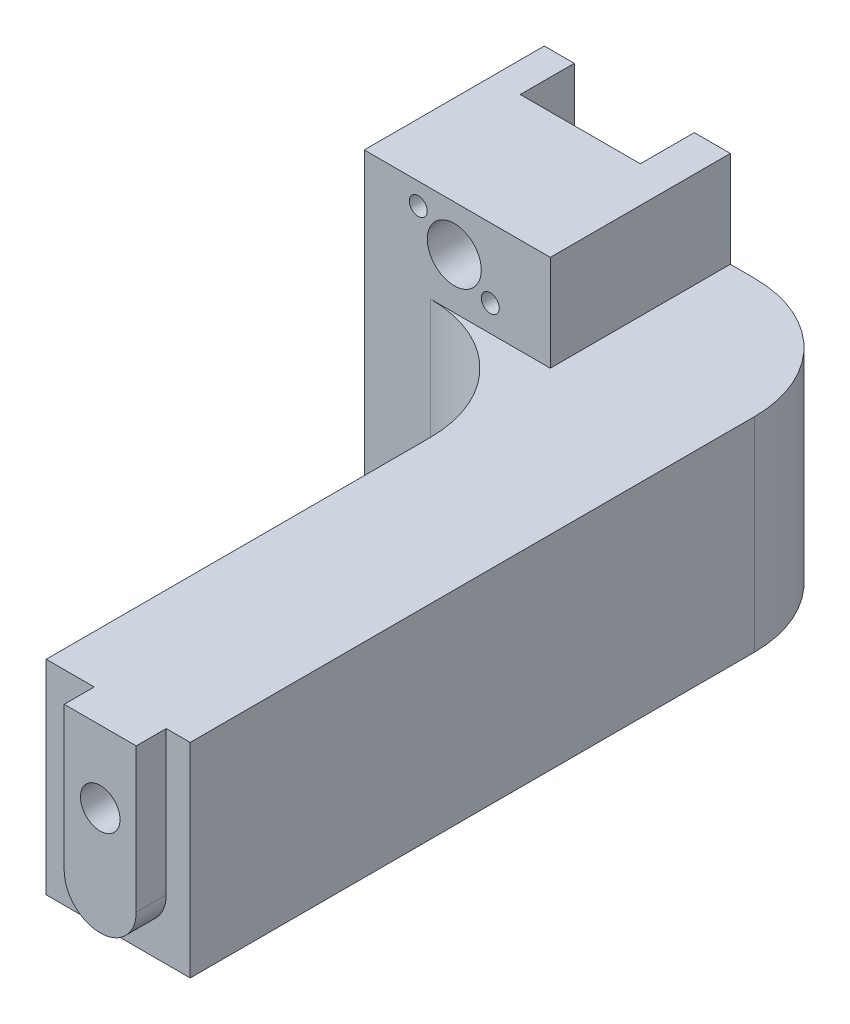
ISO-10303-21;
HEADER;
FILE_DESCRIPTION(('STEP AP214'),'2;1');
FILE_NAME('part.step','',(''),(''),'','','');
FILE_SCHEMA(('AUTOMOTIVE_DESIGN { 1 0 10303 214 1 1 1 1 }'));
ENDSEC;
DATA;
#1=APPLICATION_CONTEXT('core data for automotive mechanical design processes');
#2=APPLICATION_PROTOCOL_DEFINITION('international standard','automotive_design',2000,#1);
#3=PRODUCT_CONTEXT('',#1,'mechanical');
#4=PRODUCT('Part','Part','',(#3));
#5=PRODUCT_RELATED_PRODUCT_CATEGORY('part','',(#4));
#6=PRODUCT_DEFINITION_FORMATION('','',#4);
#7=PRODUCT_DEFINITION_CONTEXT('part definition',#1,'design');
#8=PRODUCT_DEFINITION('design','',#6,#7);
#9=PRODUCT_DEFINITION_SHAPE('','',#8);
#10=(LENGTH_UNIT() NAMED_UNIT(*) SI_UNIT(.MILLI.,.METRE.));
#11=(NAMED_UNIT(*) PLANE_ANGLE_UNIT() SI_UNIT($,.RADIAN.));
#12=(NAMED_UNIT(*) SI_UNIT($,.STERADIAN.) SOLID_ANGLE_UNIT());
#13=UNCERTAINTY_MEASURE_WITH_UNIT(LENGTH_MEASURE(1.E-05),#10,'distance_accuracy_value','');
#14=(GEOMETRIC_REPRESENTATION_CONTEXT(3) GLOBAL_UNCERTAINTY_ASSIGNED_CONTEXT((#13)) GLOBAL_UNIT_ASSIGNED_CONTEXT((#10,
#11,#12)) REPRESENTATION_CONTEXT('',''));
#15=CARTESIAN_POINT('',(0.,0.,0.));
#16=DIRECTION('',(0.,0.,1.));
#17=DIRECTION('',(1.,0.,0.));
#18=AXIS2_PLACEMENT_3D('',#15,#16,#17);
#19=CARTESIAN_POINT('',(-13.75,25.,28.5));
#20=DIRECTION('',(0.,0.,-1.));
#21=DIRECTION('',(-1.,0.,0.));
#22=AXIS2_PLACEMENT_3D('',#19,#20,#21);
#23=PLANE('',#22);
#24=DIRECTION('',(1.,0.,0.));
#25=VECTOR('',#24,1.);
#26=CARTESIAN_POINT('',(-13.75,17.,28.5));
#27=LINE('',#26,#25);
#28=CARTESIAN_POINT('',(1.75000000000001,17.,28.5));
#29=VERTEX_POINT('',#28);
#30=CARTESIAN_POINT('',(5.75,17.,28.5));
#31=VERTEX_POINT('',#30);
#32=EDGE_CURVE('E272',#29,#31,#27,.T.);
#33=ORIENTED_EDGE('',*,*,#32,.F.);
#34=DIRECTION('',(0.,1.,0.));
#35=VECTOR('',#34,1.);
#36=CARTESIAN_POINT('',(1.75000000000001,0.,28.5));
#37=LINE('',#36,#35);
#38=CARTESIAN_POINT('',(1.75000000000001,0.,28.5));
#39=VERTEX_POINT('',#38);
#40=EDGE_CURVE('E184',#39,#29,#37,.T.);
#41=ORIENTED_EDGE('',*,*,#40,.F.);
#42=DIRECTION('',(1.,0.,0.));
#43=VECTOR('',#42,1.);
#44=CARTESIAN_POINT('',(-13.75,0.,28.5));
#45=LINE('',#44,#43);
#46=CARTESIAN_POINT('',(13.75,0.,28.5));
#47=VERTEX_POINT('',#46);
#48=EDGE_CURVE('E202',#39,#47,#45,.T.);
#49=ORIENTED_EDGE('',*,*,#48,.T.);
#50=DIRECTION('',(0.,-1.,0.));
#51=VECTOR('',#50,1.);
#52=CARTESIAN_POINT('',(13.75,25.,28.5));
#53=LINE('',#52,#51);
#54=CARTESIAN_POINT('',(13.75,17.,28.5));
#55=VERTEX_POINT('',#54);
#56=EDGE_CURVE('E211',#55,#47,#53,.T.);
#57=ORIENTED_EDGE('',*,*,#56,.F.);
#58=DIRECTION('',(1.,0.,0.));
#59=VECTOR('',#58,1.);
#60=CARTESIAN_POINT('',(11.75,17.,28.5));
#61=LINE('',#60,#59);
#62=CARTESIAN_POINT('',(11.75,17.,28.5));
#63=VERTEX_POINT('',#62);
#64=EDGE_CURVE('E468',#63,#55,#61,.T.);
#65=ORIENTED_EDGE('',*,*,#64,.F.);
#66=DIRECTION('',(0.,1.,0.));
#67=VECTOR('',#66,1.);
#68=CARTESIAN_POINT('',(11.75,25.,28.5));
#69=LINE('',#68,#67);
#70=CARTESIAN_POINT('',(11.75,5.,28.5));
#71=VERTEX_POINT('',#70);
#72=EDGE_CURVE('E337',#71,#63,#69,.T.);
#73=ORIENTED_EDGE('',*,*,#72,.F.);
#74=CARTESIAN_POINT('',(8.75,5.,28.5));
#75=DIRECTION('',(0.,0.,1.));
#76=DIRECTION('',(1.,0.,0.));
#77=AXIS2_PLACEMENT_3D('',#74,#75,#76);
#78=CIRCLE('',#77,3.);
#79=CARTESIAN_POINT('',(5.75,5.,28.5));
#80=VERTEX_POINT('',#79);
#81=EDGE_CURVE('E314',#80,#71,#78,.T.);
#82=ORIENTED_EDGE('',*,*,#81,.F.);
#83=DIRECTION('',(0.,-1.,0.));
#84=VECTOR('',#83,1.);
#85=CARTESIAN_POINT('',(5.75,5.,28.5));
#86=LINE('',#85,#84);
#87=EDGE_CURVE('E329',#31,#80,#86,.T.);
#88=ORIENTED_EDGE('',*,*,#87,.F.);
#89=EDGE_LOOP('',(#33,#41,#49,#57,#65,#73,#82,#88));
#90=FACE_BOUND('',#89,.T.);
#91=ADVANCED_FACE('F36',(#90),#23,.F.);
#92=CARTESIAN_POINT('',(13.75,25.,-28.5));
#93=DIRECTION('',(-1.,0.,0.));
#94=DIRECTION('',(0.,0.,1.));
#95=AXIS2_PLACEMENT_3D('',#92,#93,#94);
#96=PLANE('',#95);
#97=DIRECTION('',(0.,0.,-1.));
#98=VECTOR('',#97,1.);
#99=CARTESIAN_POINT('',(13.75,0.,-28.5));
#100=LINE('',#99,#98);
#101=CARTESIAN_POINT('',(13.75,0.,-18.5));
#102=VERTEX_POINT('',#101);
#103=EDGE_CURVE('E207',#47,#102,#100,.T.);
#104=ORIENTED_EDGE('',*,*,#103,.T.);
#105=DIRECTION('',(0.,-1.,0.));
#106=VECTOR('',#105,1.);
#107=CARTESIAN_POINT('',(13.75,25.,-18.5));
#108=LINE('',#107,#106);
#109=CARTESIAN_POINT('',(13.75,17.,-18.5));
#110=VERTEX_POINT('',#109);
#111=EDGE_CURVE('E234',#102,#110,#108,.F.);
#112=ORIENTED_EDGE('',*,*,#111,.T.);
#113=DIRECTION('',(0.,0.,-1.));
#114=VECTOR('',#113,1.);
#115=CARTESIAN_POINT('',(13.75,17.,28.5));
#116=LINE('',#115,#114);
#117=EDGE_CURVE('E267',#55,#110,#116,.T.);
#118=ORIENTED_EDGE('',*,*,#117,.F.);
#119=ORIENTED_EDGE('',*,*,#56,.T.);
#120=EDGE_LOOP('',(#104,#112,#118,#119));
#121=FACE_BOUND('',#120,.T.);
#122=ADVANCED_FACE('F351',(#121),#96,.F.);
#123=CARTESIAN_POINT('',(11.75,25.,31.));
#124=DIRECTION('',(-1.,0.,0.));
#125=DIRECTION('',(0.,-1.,0.));
#126=AXIS2_PLACEMENT_3D('',#123,#124,#125);
#127=PLANE('',#126);
#128=DIRECTION('',(0.,0.,-1.));
#129=VECTOR('',#128,1.);
#130=CARTESIAN_POINT('',(11.75,17.,31.));
#131=LINE('',#130,#129);
#132=CARTESIAN_POINT('',(11.75,17.,31.));
#133=VERTEX_POINT('',#132);
#134=EDGE_CURVE('E466',#133,#63,#131,.T.);
#135=ORIENTED_EDGE('',*,*,#134,.F.);
#136=DIRECTION('',(0.,1.,0.));
#137=VECTOR('',#136,1.);
#138=CARTESIAN_POINT('',(11.75,25.,31.));
#139=LINE('',#138,#137);
#140=CARTESIAN_POINT('',(11.75,5.,31.));
#141=VERTEX_POINT('',#140);
#142=EDGE_CURVE('E328',#141,#133,#139,.T.);
#143=ORIENTED_EDGE('',*,*,#142,.F.);
#144=DIRECTION('',(0.,0.,-1.));
#145=VECTOR('',#144,1.);
#146=CARTESIAN_POINT('',(11.75,5.,31.));
#147=LINE('',#146,#145);
#148=EDGE_CURVE('E343',#141,#71,#147,.T.);
#149=ORIENTED_EDGE('',*,*,#148,.T.);
#150=ORIENTED_EDGE('',*,*,#72,.T.);
#151=EDGE_LOOP('',(#135,#143,#149,#150));
#152=FACE_BOUND('',#151,.T.);
#153=ADVANCED_FACE('F409',(#152),#127,.F.);
#154=CARTESIAN_POINT('',(5.75,5.,31.));
#155=DIRECTION('',(1.,0.,0.));
#156=DIRECTION('',(0.,1.,0.));
#157=AXIS2_PLACEMENT_3D('',#154,#155,#156);
#158=PLANE('',#157);
#159=DIRECTION('',(0.,0.,1.));
#160=VECTOR('',#159,1.);
#161=CARTESIAN_POINT('',(5.75,17.,28.5));
#162=LINE('',#161,#160);
#163=CARTESIAN_POINT('',(5.75,17.,31.));
#164=VERTEX_POINT('',#163);
#165=EDGE_CURVE('E471',#31,#164,#162,.T.);
#166=ORIENTED_EDGE('',*,*,#165,.F.);
#167=ORIENTED_EDGE('',*,*,#87,.T.);
#168=DIRECTION('',(0.,0.,-1.));
#169=VECTOR('',#168,1.);
#170=CARTESIAN_POINT('',(5.75,5.,31.));
#171=LINE('',#170,#169);
#172=CARTESIAN_POINT('',(5.75,5.,31.));
#173=VERTEX_POINT('',#172);
#174=EDGE_CURVE('E334',#173,#80,#171,.T.);
#175=ORIENTED_EDGE('',*,*,#174,.F.);
#176=DIRECTION('',(0.,-1.,0.));
#177=VECTOR('',#176,1.);
#178=CARTESIAN_POINT('',(5.75,5.,31.));
#179=LINE('',#178,#177);
#180=EDGE_CURVE('E332',#164,#173,#179,.T.);
#181=ORIENTED_EDGE('',*,*,#180,.F.);
#182=EDGE_LOOP('',(#166,#167,#175,#181));
#183=FACE_BOUND('',#182,.T.);
#184=ADVANCED_FACE('F457',(#183),#158,.F.);
#185=CARTESIAN_POINT('',(8.75,5.,31.));
#186=DIRECTION('',(0.,0.,1.));
#187=DIRECTION('',(1.,0.,0.));
#188=AXIS2_PLACEMENT_3D('',#185,#186,#187);
#189=PLANE('',#188);
#190=CARTESIAN_POINT('',(8.75,11.,31.));
#191=DIRECTION('',(0.,0.,1.));
#192=DIRECTION('',(1.,0.,0.));
#193=AXIS2_PLACEMENT_3D('',#190,#191,#192);
#194=CIRCLE('',#193,1.65);
#195=CARTESIAN_POINT('',(10.4,11.,31.));
#196=VERTEX_POINT('',#195);
#197=EDGE_CURVE('E195',#196,#196,#194,.T.);
#198=ORIENTED_EDGE('',*,*,#197,.F.);
#199=EDGE_LOOP('',(#198));
#200=FACE_BOUND('',#199,.T.);
#201=ORIENTED_EDGE('',*,*,#142,.T.);
#202=DIRECTION('',(1.,0.,0.));
#203=VECTOR('',#202,1.);
#204=CARTESIAN_POINT('',(5.75,17.,31.));
#205=LINE('',#204,#203);
#206=EDGE_CURVE('E460',#164,#133,#205,.T.);
#207=ORIENTED_EDGE('',*,*,#206,.F.);
#208=ORIENTED_EDGE('',*,*,#180,.T.);
#209=CARTESIAN_POINT('',(8.75,5.,31.));
#210=DIRECTION('',(0.,0.,1.));
#211=DIRECTION('',(1.,0.,0.));
#212=AXIS2_PLACEMENT_3D('',#209,#210,#211);
#213=CIRCLE('',#212,3.);
#214=EDGE_CURVE('E325',#173,#141,#213,.T.);
#215=ORIENTED_EDGE('',*,*,#214,.T.);
#216=EDGE_LOOP('',(#201,#207,#208,#215));
#217=FACE_BOUND('',#216,.T.);
#218=ADVANCED_FACE('F418',(#200,#217),#189,.T.);
#219=CARTESIAN_POINT('',(-13.75,25.,-28.5));
#220=DIRECTION('',(0.,0.,1.));
#221=DIRECTION('',(1.,0.,0.));
#222=AXIS2_PLACEMENT_3D('',#219,#220,#221);
#223=PLANE('',#222);
#224=DIRECTION('',(-1.,0.,0.));
#225=VECTOR('',#224,1.);
#226=CARTESIAN_POINT('',(1.75,17.,-28.5));
#227=LINE('',#226,#225);
#228=CARTESIAN_POINT('',(3.75,17.,-28.5));
#229=VERTEX_POINT('',#228);
#230=CARTESIAN_POINT('',(1.75,17.,-28.5));
#231=VERTEX_POINT('',#230);
#232=EDGE_CURVE('E264',#229,#231,#227,.T.);
#233=ORIENTED_EDGE('',*,*,#232,.F.);
#234=DIRECTION('',(0.,-1.,0.));
#235=VECTOR('',#234,1.);
#236=CARTESIAN_POINT('',(3.75,25.,-28.5));
#237=LINE('',#236,#235);
#238=CARTESIAN_POINT('',(3.75,0.,-28.5));
#239=VERTEX_POINT('',#238);
#240=EDGE_CURVE('E216',#229,#239,#237,.T.);
#241=ORIENTED_EDGE('',*,*,#240,.T.);
#242=DIRECTION('',(-1.,0.,0.));
#243=VECTOR('',#242,1.);
#244=CARTESIAN_POINT('',(-13.75,0.,-28.5));
#245=LINE('',#244,#243);
#246=CARTESIAN_POINT('',(-13.75,0.,-28.5));
#247=VERTEX_POINT('',#246);
#248=EDGE_CURVE('E203',#239,#247,#245,.T.);
#249=ORIENTED_EDGE('',*,*,#248,.T.);
#250=DIRECTION('',(0.,-1.,0.));
#251=VECTOR('',#250,1.);
#252=CARTESIAN_POINT('',(-13.75,25.,-28.5));
#253=LINE('',#252,#251);
#254=CARTESIAN_POINT('',(-13.75,25.,-28.5));
#255=VERTEX_POINT('',#254);
#256=EDGE_CURVE('E201',#255,#247,#253,.T.);
#257=ORIENTED_EDGE('',*,*,#256,.F.);
#258=DIRECTION('',(-1.,0.,0.));
#259=VECTOR('',#258,1.);
#260=CARTESIAN_POINT('',(-13.75,25.,-28.5));
#261=LINE('',#260,#259);
#262=CARTESIAN_POINT('',(-11.25,25.,-28.5));
#263=VERTEX_POINT('',#262);
#264=EDGE_CURVE('E205',#263,#255,#261,.T.);
#265=ORIENTED_EDGE('',*,*,#264,.F.);
#266=DIRECTION('',(0.,1.,0.));
#267=VECTOR('',#266,1.);
#268=CARTESIAN_POINT('',(-11.25,25.,-28.5));
#269=LINE('',#268,#267);
#270=CARTESIAN_POINT('',(-11.25,17.2,-28.5));
#271=VERTEX_POINT('',#270);
#272=EDGE_CURVE('E284',#271,#263,#269,.T.);
#273=ORIENTED_EDGE('',*,*,#272,.F.);
#274=CARTESIAN_POINT('',(-8.75,17.2,-28.5));
#275=DIRECTION('',(0.,0.,-1.));
#276=DIRECTION('',(-1.,0.,0.));
#277=AXIS2_PLACEMENT_3D('',#274,#275,#276);
#278=CIRCLE('',#277,2.5);
#279=CARTESIAN_POINT('',(-8.75,14.7,-28.5));
#280=VERTEX_POINT('',#279);
#281=EDGE_CURVE('E307',#280,#271,#278,.T.);
#282=ORIENTED_EDGE('',*,*,#281,.F.);
#283=DIRECTION('',(-1.,0.,0.));
#284=VECTOR('',#283,1.);
#285=CARTESIAN_POINT('',(-3.75,14.7,-28.5));
#286=LINE('',#285,#284);
#287=CARTESIAN_POINT('',(-3.75,14.7,-28.5));
#288=VERTEX_POINT('',#287);
#289=EDGE_CURVE('E304',#288,#280,#286,.T.);
#290=ORIENTED_EDGE('',*,*,#289,.F.);
#291=CARTESIAN_POINT('',(-3.75,17.2,-28.5));
#292=DIRECTION('',(0.,0.,-1.));
#293=DIRECTION('',(-1.,0.,0.));
#294=AXIS2_PLACEMENT_3D('',#291,#292,#293);
#295=CIRCLE('',#294,2.5);
#296=CARTESIAN_POINT('',(-1.25,17.2,-28.5));
#297=VERTEX_POINT('',#296);
#298=EDGE_CURVE('E301',#297,#288,#295,.T.);
#299=ORIENTED_EDGE('',*,*,#298,.F.);
#300=DIRECTION('',(0.,-1.,0.));
#301=VECTOR('',#300,1.);
#302=CARTESIAN_POINT('',(-1.25,25.,-28.5));
#303=LINE('',#302,#301);
#304=CARTESIAN_POINT('',(-1.25,25.,-28.5));
#305=VERTEX_POINT('',#304);
#306=EDGE_CURVE('E279',#305,#297,#303,.T.);
#307=ORIENTED_EDGE('',*,*,#306,.F.);
#308=CARTESIAN_POINT('',(1.75,25.,-28.5));
#309=VERTEX_POINT('',#308);
#310=EDGE_CURVE('E346',#309,#305,#261,.T.);
#311=ORIENTED_EDGE('',*,*,#310,.F.);
#312=DIRECTION('',(0.,1.,0.));
#313=VECTOR('',#312,1.);
#314=CARTESIAN_POINT('',(1.75,17.,-28.5));
#315=LINE('',#314,#313);
#316=EDGE_CURVE('E259',#231,#309,#315,.T.);
#317=ORIENTED_EDGE('',*,*,#316,.F.);
#318=EDGE_LOOP('',(#233,#241,#249,#257,#265,#273,#282,#290,#299,#307,#311,#317));
#319=FACE_BOUND('',#318,.T.);
#320=ADVANCED_FACE('F359',(#319),#223,.F.);
#321=CARTESIAN_POINT('',(-13.75,25.,-28.5));
#322=DIRECTION('',(1.,0.,0.));
#323=DIRECTION('',(0.,0.,-1.));
#324=AXIS2_PLACEMENT_3D('',#321,#322,#323);
#325=PLANE('',#324);
#326=DIRECTION('',(0.,0.,1.));
#327=VECTOR('',#326,1.);
#328=CARTESIAN_POINT('',(-13.75,0.,-28.5));
#329=LINE('',#328,#327);
#330=CARTESIAN_POINT('',(-13.75,0.,-13.5));
#331=VERTEX_POINT('',#330);
#332=EDGE_CURVE('E179',#247,#331,#329,.T.);
#333=ORIENTED_EDGE('',*,*,#332,.T.);
#334=DIRECTION('',(0.,1.,0.));
#335=VECTOR('',#334,1.);
#336=CARTESIAN_POINT('',(-13.75,17.,-13.5));
#337=LINE('',#336,#335);
#338=CARTESIAN_POINT('',(-13.75,25.,-13.5));
#339=VERTEX_POINT('',#338);
#340=EDGE_CURVE('E188',#331,#339,#337,.T.);
#341=ORIENTED_EDGE('',*,*,#340,.T.);
#342=DIRECTION('',(0.,0.,1.));
#343=VECTOR('',#342,1.);
#344=CARTESIAN_POINT('',(-13.75,25.,-28.5));
#345=LINE('',#344,#343);
#346=EDGE_CURVE('E214',#255,#339,#345,.T.);
#347=ORIENTED_EDGE('',*,*,#346,.F.);
#348=ORIENTED_EDGE('',*,*,#256,.T.);
#349=EDGE_LOOP('',(#333,#341,#347,#348));
#350=FACE_BOUND('',#349,.T.);
#351=ADVANCED_FACE('F199',(#350),#325,.F.);
#352=CARTESIAN_POINT('',(0.,25.,0.));
#353=DIRECTION('',(0.,1.,0.));
#354=DIRECTION('',(0.,0.,1.));
#355=AXIS2_PLACEMENT_3D('',#352,#353,#354);
#356=PLANE('',#355);
#357=DIRECTION('',(-1.,0.,0.));
#358=VECTOR('',#357,1.);
#359=CARTESIAN_POINT('',(-13.75,25.,-13.5));
#360=LINE('',#359,#358);
#361=CARTESIAN_POINT('',(1.75,25.,-13.5));
#362=VERTEX_POINT('',#361);
#363=EDGE_CURVE('E191',#362,#339,#360,.T.);
#364=ORIENTED_EDGE('',*,*,#363,.F.);
#365=DIRECTION('',(0.,0.,1.));
#366=VECTOR('',#365,1.);
#367=CARTESIAN_POINT('',(1.75,25.,-28.5));
#368=LINE('',#367,#366);
#369=EDGE_CURVE('E220',#309,#362,#368,.T.);
#370=ORIENTED_EDGE('',*,*,#369,.F.);
#371=ORIENTED_EDGE('',*,*,#310,.T.);
#372=DIRECTION('',(0.,0.,-1.));
#373=VECTOR('',#372,1.);
#374=CARTESIAN_POINT('',(-1.25,25.,-24.));
#375=LINE('',#374,#373);
#376=CARTESIAN_POINT('',(-1.25,25.,-24.));
#377=VERTEX_POINT('',#376);
#378=EDGE_CURVE('E311',#377,#305,#375,.T.);
#379=ORIENTED_EDGE('',*,*,#378,.F.);
#380=DIRECTION('',(1.,0.,0.));
#381=VECTOR('',#380,1.);
#382=CARTESIAN_POINT('',(-1.25,25.,-24.));
#383=LINE('',#382,#381);
#384=CARTESIAN_POINT('',(-11.25,25.,-24.));
#385=VERTEX_POINT('',#384);
#386=EDGE_CURVE('E295',#385,#377,#383,.T.);
#387=ORIENTED_EDGE('',*,*,#386,.F.);
#388=DIRECTION('',(0.,0.,-1.));
#389=VECTOR('',#388,1.);
#390=CARTESIAN_POINT('',(-11.25,25.,-24.));
#391=LINE('',#390,#389);
#392=EDGE_CURVE('E315',#385,#263,#391,.T.);
#393=ORIENTED_EDGE('',*,*,#392,.T.);
#394=ORIENTED_EDGE('',*,*,#264,.T.);
#395=ORIENTED_EDGE('',*,*,#346,.T.);
#396=EDGE_LOOP('',(#364,#370,#371,#379,#387,#393,#394,#395));
#397=FACE_BOUND('',#396,.T.);
#398=ADVANCED_FACE('F363',(#397),#356,.T.);
#399=CARTESIAN_POINT('',(0.,0.,0.));
#400=DIRECTION('',(0.,1.,0.));
#401=DIRECTION('',(0.,0.,1.));
#402=AXIS2_PLACEMENT_3D('',#399,#400,#401);
#403=PLANE('',#402);
#404=ORIENTED_EDGE('',*,*,#248,.F.);
#405=CARTESIAN_POINT('',(3.75,0.,-18.5));
#406=DIRECTION('',(0.,1.,0.));
#407=DIRECTION('',(0.,0.,1.));
#408=AXIS2_PLACEMENT_3D('',#405,#406,#407);
#409=CIRCLE('',#408,10.);
#410=EDGE_CURVE('E232',#239,#102,#409,.F.);
#411=ORIENTED_EDGE('',*,*,#410,.T.);
#412=ORIENTED_EDGE('',*,*,#103,.F.);
#413=ORIENTED_EDGE('',*,*,#48,.F.);
#414=DIRECTION('',(0.,0.,-1.));
#415=VECTOR('',#414,1.);
#416=CARTESIAN_POINT('',(1.75,0.,-13.5));
#417=LINE('',#416,#415);
#418=CARTESIAN_POINT('',(1.75,0.,-3.5));
#419=VERTEX_POINT('',#418);
#420=EDGE_CURVE('E185',#39,#419,#417,.T.);
#421=ORIENTED_EDGE('',*,*,#420,.T.);
#422=CARTESIAN_POINT('',(-8.25,0.,-3.49999999999999));
#423=DIRECTION('',(0.,1.,0.));
#424=DIRECTION('',(0.,0.,1.));
#425=AXIS2_PLACEMENT_3D('',#422,#423,#424);
#426=CIRCLE('',#425,10.);
#427=CARTESIAN_POINT('',(-8.25,0.,-13.5));
#428=VERTEX_POINT('',#427);
#429=EDGE_CURVE('E11',#419,#428,#426,.T.);
#430=ORIENTED_EDGE('',*,*,#429,.T.);
#431=DIRECTION('',(-1.,0.,0.));
#432=VECTOR('',#431,1.);
#433=CARTESIAN_POINT('',(1.75,0.,-13.5));
#434=LINE('',#433,#432);
#435=EDGE_CURVE('E174',#428,#331,#434,.T.);
#436=ORIENTED_EDGE('',*,*,#435,.T.);
#437=ORIENTED_EDGE('',*,*,#332,.F.);
#438=EDGE_LOOP('',(#404,#411,#412,#413,#421,#430,#436,#437));
#439=FACE_BOUND('',#438,.T.);
#440=ADVANCED_FACE('F177',(#439),#403,.F.);
#441=CARTESIAN_POINT('',(8.75,5.,31.));
#442=DIRECTION('',(0.,0.,-1.));
#443=DIRECTION('',(-1.,0.,0.));
#444=AXIS2_PLACEMENT_3D('',#441,#442,#443);
#445=CYLINDRICAL_SURFACE('',#444,3.);
#446=ORIENTED_EDGE('',*,*,#81,.T.);
#447=ORIENTED_EDGE('',*,*,#148,.F.);
#448=ORIENTED_EDGE('',*,*,#214,.F.);
#449=ORIENTED_EDGE('',*,*,#174,.T.);
#450=EDGE_LOOP('',(#446,#447,#448,#449));
#451=FACE_BOUND('',#450,.T.);
#452=ADVANCED_FACE('F489',(#451),#445,.T.);
#453=CARTESIAN_POINT('',(-1.25,25.,-24.));
#454=DIRECTION('',(1.,0.,0.));
#455=DIRECTION('',(0.,1.,0.));
#456=AXIS2_PLACEMENT_3D('',#453,#454,#455);
#457=PLANE('',#456);
#458=ORIENTED_EDGE('',*,*,#306,.T.);
#459=DIRECTION('',(0.,0.,-1.));
#460=VECTOR('',#459,1.);
#461=CARTESIAN_POINT('',(-1.25,17.2,-24.));
#462=LINE('',#461,#460);
#463=CARTESIAN_POINT('',(-1.25,17.2,-24.));
#464=VERTEX_POINT('',#463);
#465=EDGE_CURVE('E298',#464,#297,#462,.T.);
#466=ORIENTED_EDGE('',*,*,#465,.F.);
#467=DIRECTION('',(0.,-1.,0.));
#468=VECTOR('',#467,1.);
#469=CARTESIAN_POINT('',(-1.25,25.,-24.));
#470=LINE('',#469,#468);
#471=EDGE_CURVE('E280',#377,#464,#470,.T.);
#472=ORIENTED_EDGE('',*,*,#471,.F.);
#473=ORIENTED_EDGE('',*,*,#378,.T.);
#474=EDGE_LOOP('',(#458,#466,#472,#473));
#475=FACE_BOUND('',#474,.T.);
#476=ADVANCED_FACE('F385',(#475),#457,.F.);
#477=CARTESIAN_POINT('',(-11.25,25.,-24.));
#478=DIRECTION('',(-1.,0.,0.));
#479=DIRECTION('',(0.,-1.,0.));
#480=AXIS2_PLACEMENT_3D('',#477,#478,#479);
#481=PLANE('',#480);
#482=ORIENTED_EDGE('',*,*,#272,.T.);
#483=ORIENTED_EDGE('',*,*,#392,.F.);
#484=DIRECTION('',(0.,1.,0.));
#485=VECTOR('',#484,1.);
#486=CARTESIAN_POINT('',(-11.25,25.,-24.));
#487=LINE('',#486,#485);
#488=CARTESIAN_POINT('',(-11.25,17.2,-24.));
#489=VERTEX_POINT('',#488);
#490=EDGE_CURVE('E293',#489,#385,#487,.T.);
#491=ORIENTED_EDGE('',*,*,#490,.F.);
#492=DIRECTION('',(0.,0.,-1.));
#493=VECTOR('',#492,1.);
#494=CARTESIAN_POINT('',(-11.25,17.2,-24.));
#495=LINE('',#494,#493);
#496=EDGE_CURVE('E318',#489,#271,#495,.T.);
#497=ORIENTED_EDGE('',*,*,#496,.T.);
#498=EDGE_LOOP('',(#482,#483,#491,#497));
#499=FACE_BOUND('',#498,.T.);
#500=ADVANCED_FACE('F372',(#499),#481,.F.);
#501=CARTESIAN_POINT('',(-8.75,17.2,-24.));
#502=DIRECTION('',(0.,0.,-1.));
#503=DIRECTION('',(-1.,0.,0.));
#504=AXIS2_PLACEMENT_3D('',#501,#502,#503);
#505=CYLINDRICAL_SURFACE('',#504,2.5);
#506=ORIENTED_EDGE('',*,*,#281,.T.);
#507=ORIENTED_EDGE('',*,*,#496,.F.);
#508=CARTESIAN_POINT('',(-8.75,17.2,-24.));
#509=DIRECTION('',(0.,0.,-1.));
#510=DIRECTION('',(-1.,0.,0.));
#511=AXIS2_PLACEMENT_3D('',#508,#509,#510);
#512=CIRCLE('',#511,2.5);
#513=CARTESIAN_POINT('',(-8.75,14.7,-24.));
#514=VERTEX_POINT('',#513);
#515=EDGE_CURVE('E290',#514,#489,#512,.T.);
#516=ORIENTED_EDGE('',*,*,#515,.F.);
#517=DIRECTION('',(0.,0.,-1.));
#518=VECTOR('',#517,1.);
#519=CARTESIAN_POINT('',(-8.75,14.7,-24.));
#520=LINE('',#519,#518);
#521=EDGE_CURVE('E320',#514,#280,#520,.T.);
#522=ORIENTED_EDGE('',*,*,#521,.T.);
#523=EDGE_LOOP('',(#506,#507,#516,#522));
#524=FACE_BOUND('',#523,.T.);
#525=ADVANCED_FACE('F376',(#524),#505,.F.);
#526=CARTESIAN_POINT('',(-3.75,14.7,-24.));
#527=DIRECTION('',(0.,-1.,0.));
#528=DIRECTION('',(0.,0.,-1.));
#529=AXIS2_PLACEMENT_3D('',#526,#527,#528);
#530=PLANE('',#529);
#531=ORIENTED_EDGE('',*,*,#289,.T.);
#532=ORIENTED_EDGE('',*,*,#521,.F.);
#533=DIRECTION('',(-1.,0.,0.));
#534=VECTOR('',#533,1.);
#535=CARTESIAN_POINT('',(-3.75,14.7,-24.));
#536=LINE('',#535,#534);
#537=CARTESIAN_POINT('',(-3.75,14.7,-24.));
#538=VERTEX_POINT('',#537);
#539=EDGE_CURVE('E287',#538,#514,#536,.T.);
#540=ORIENTED_EDGE('',*,*,#539,.F.);
#541=DIRECTION('',(0.,0.,-1.));
#542=VECTOR('',#541,1.);
#543=CARTESIAN_POINT('',(-3.75,14.7,-24.));
#544=LINE('',#543,#542);
#545=EDGE_CURVE('E322',#538,#288,#544,.T.);
#546=ORIENTED_EDGE('',*,*,#545,.T.);
#547=EDGE_LOOP('',(#531,#532,#540,#546));
#548=FACE_BOUND('',#547,.T.);
#549=ADVANCED_FACE('F379',(#548),#530,.F.);
#550=CARTESIAN_POINT('',(-3.75,17.2,-24.));
#551=DIRECTION('',(0.,0.,-1.));
#552=DIRECTION('',(-1.,0.,0.));
#553=AXIS2_PLACEMENT_3D('',#550,#551,#552);
#554=CYLINDRICAL_SURFACE('',#553,2.5);
#555=ORIENTED_EDGE('',*,*,#298,.T.);
#556=ORIENTED_EDGE('',*,*,#545,.F.);
#557=CARTESIAN_POINT('',(-3.75,17.2,-24.));
#558=DIRECTION('',(0.,0.,-1.));
#559=DIRECTION('',(-1.,0.,0.));
#560=AXIS2_PLACEMENT_3D('',#557,#558,#559);
#561=CIRCLE('',#560,2.5);
#562=EDGE_CURVE('E283',#464,#538,#561,.T.);
#563=ORIENTED_EDGE('',*,*,#562,.F.);
#564=ORIENTED_EDGE('',*,*,#465,.T.);
#565=EDGE_LOOP('',(#555,#556,#563,#564));
#566=FACE_BOUND('',#565,.T.);
#567=ADVANCED_FACE('F382',(#566),#554,.F.);
#568=CARTESIAN_POINT('',(-3.75,17.2,-24.));
#569=DIRECTION('',(0.,0.,-1.));
#570=DIRECTION('',(-1.,0.,0.));
#571=AXIS2_PLACEMENT_3D('',#568,#569,#570);
#572=PLANE('',#571);
#573=CARTESIAN_POINT('',(-9.25,23.2,-24.));
#574=DIRECTION('',(0.,0.,-1.));
#575=DIRECTION('',(-1.,0.,0.));
#576=AXIS2_PLACEMENT_3D('',#573,#574,#575);
#577=CIRCLE('',#576,0.749999999999999);
#578=CARTESIAN_POINT('',(-10.,23.2,-24.));
#579=VERTEX_POINT('',#578);
#580=EDGE_CURVE('E229',#579,#579,#577,.T.);
#581=ORIENTED_EDGE('',*,*,#580,.F.);
#582=EDGE_LOOP('',(#581));
#583=FACE_BOUND('',#582,.T.);
#584=CARTESIAN_POINT('',(-3.25,19.2,-24.));
#585=DIRECTION('',(0.,0.,-1.));
#586=DIRECTION('',(-1.,0.,0.));
#587=AXIS2_PLACEMENT_3D('',#584,#585,#586);
#588=CIRCLE('',#587,0.749999999999999);
#589=CARTESIAN_POINT('',(-4.,19.2,-24.));
#590=VERTEX_POINT('',#589);
#591=EDGE_CURVE('E225',#590,#590,#588,.T.);
#592=ORIENTED_EDGE('',*,*,#591,.F.);
#593=EDGE_LOOP('',(#592));
#594=FACE_BOUND('',#593,.T.);
#595=CARTESIAN_POINT('',(-6.25,21.2,-24.));
#596=DIRECTION('',(0.,0.,-1.));
#597=DIRECTION('',(-1.,0.,0.));
#598=AXIS2_PLACEMENT_3D('',#595,#596,#597);
#599=CIRCLE('',#598,2.24999999999999);
#600=CARTESIAN_POINT('',(-8.49999999999999,21.2,-24.));
#601=VERTEX_POINT('',#600);
#602=EDGE_CURVE('E217',#601,#601,#599,.T.);
#603=ORIENTED_EDGE('',*,*,#602,.F.);
#604=EDGE_LOOP('',(#603));
#605=FACE_BOUND('',#604,.T.);
#606=ORIENTED_EDGE('',*,*,#471,.T.);
#607=ORIENTED_EDGE('',*,*,#562,.T.);
#608=ORIENTED_EDGE('',*,*,#539,.T.);
#609=ORIENTED_EDGE('',*,*,#515,.T.);
#610=ORIENTED_EDGE('',*,*,#490,.T.);
#611=ORIENTED_EDGE('',*,*,#386,.T.);
#612=EDGE_LOOP('',(#606,#607,#608,#609,#610,#611));
#613=FACE_BOUND('',#612,.T.);
#614=ADVANCED_FACE('F387',(#583,#594,#605,#613),#572,.T.);
#615=CARTESIAN_POINT('',(8.75,11.,20.9));
#616=DIRECTION('',(0.,0.,1.));
#617=DIRECTION('',(1.,0.,0.));
#618=AXIS2_PLACEMENT_3D('',#615,#616,#617);
#619=CONICAL_SURFACE('',#618,1.65,1.02974425867665);
#620=CARTESIAN_POINT('',(8.75,11.,19.9085799786045));
#621=VERTEX_POINT('',#620);
#622=VERTEX_LOOP('',#621);
#623=FACE_BOUND('',#622,.T.);
#624=CARTESIAN_POINT('',(8.75,11.,20.9));
#625=DIRECTION('',(0.,0.,1.));
#626=DIRECTION('',(1.,0.,0.));
#627=AXIS2_PLACEMENT_3D('',#624,#625,#626);
#628=CIRCLE('',#627,1.65);
#629=CARTESIAN_POINT('',(10.4,11.,20.9));
#630=VERTEX_POINT('',#629);
#631=EDGE_CURVE('E276',#630,#630,#628,.T.);
#632=ORIENTED_EDGE('',*,*,#631,.T.);
#633=EDGE_LOOP('',(#632));
#634=FACE_BOUND('',#633,.T.);
#635=ADVANCED_FACE('F389',(#623,#634),#619,.F.);
#636=CARTESIAN_POINT('',(8.75,11.,31.));
#637=DIRECTION('',(0.,0.,1.));
#638=DIRECTION('',(1.,0.,0.));
#639=AXIS2_PLACEMENT_3D('',#636,#637,#638);
#640=CYLINDRICAL_SURFACE('',#639,1.65);
#641=ORIENTED_EDGE('',*,*,#631,.F.);
#642=EDGE_LOOP('',(#641));
#643=FACE_BOUND('',#642,.T.);
#644=ORIENTED_EDGE('',*,*,#197,.T.);
#645=EDGE_LOOP('',(#644));
#646=FACE_BOUND('',#645,.T.);
#647=ADVANCED_FACE('F396',(#643,#646),#640,.F.);
#648=CARTESIAN_POINT('',(-13.75,17.,-13.5));
#649=DIRECTION('',(0.,0.,-1.));
#650=DIRECTION('',(-1.,0.,0.));
#651=AXIS2_PLACEMENT_3D('',#648,#649,#650);
#652=PLANE('',#651);
#653=CARTESIAN_POINT('',(-9.25,23.2,-13.5));
#654=DIRECTION('',(0.,0.,-1.));
#655=DIRECTION('',(-1.,0.,0.));
#656=AXIS2_PLACEMENT_3D('',#653,#654,#655);
#657=CIRCLE('',#656,0.749999999999993);
#658=CARTESIAN_POINT('',(-9.99999999999999,23.2,-13.5));
#659=VERTEX_POINT('',#658);
#660=EDGE_CURVE('E226',#659,#659,#657,.T.);
#661=ORIENTED_EDGE('',*,*,#660,.T.);
#662=EDGE_LOOP('',(#661));
#663=FACE_BOUND('',#662,.T.);
#664=CARTESIAN_POINT('',(-3.25,19.2,-13.5));
#665=DIRECTION('',(0.,0.,-1.));
#666=DIRECTION('',(-1.,0.,0.));
#667=AXIS2_PLACEMENT_3D('',#664,#665,#666);
#668=CIRCLE('',#667,0.749999999999993);
#669=CARTESIAN_POINT('',(-3.99999999999999,19.2,-13.5));
#670=VERTEX_POINT('',#669);
#671=EDGE_CURVE('E222',#670,#670,#668,.T.);
#672=ORIENTED_EDGE('',*,*,#671,.T.);
#673=EDGE_LOOP('',(#672));
#674=FACE_BOUND('',#673,.T.);
#675=CARTESIAN_POINT('',(-6.25,21.2,-13.5));
#676=DIRECTION('',(0.,0.,1.));
#677=DIRECTION('',(1.,0.,0.));
#678=AXIS2_PLACEMENT_3D('',#675,#676,#677);
#679=CIRCLE('',#678,2.24999999999999);
#680=CARTESIAN_POINT('',(-4.00000000000001,21.2,-13.5));
#681=VERTEX_POINT('',#680);
#682=EDGE_CURVE('E221',#681,#681,#679,.T.);
#683=ORIENTED_EDGE('',*,*,#682,.F.);
#684=EDGE_LOOP('',(#683));
#685=FACE_BOUND('',#684,.T.);
#686=ORIENTED_EDGE('',*,*,#435,.F.);
#687=DIRECTION('',(0.,1.,0.));
#688=VECTOR('',#687,1.);
#689=CARTESIAN_POINT('',(-8.25,17.,-13.5));
#690=LINE('',#689,#688);
#691=CARTESIAN_POINT('',(-8.25,17.,-13.5));
#692=VERTEX_POINT('',#691);
#693=EDGE_CURVE('E240',#428,#692,#690,.T.);
#694=ORIENTED_EDGE('',*,*,#693,.T.);
#695=DIRECTION('',(1.,0.,0.));
#696=VECTOR('',#695,1.);
#697=CARTESIAN_POINT('',(-13.75,17.,-13.5));
#698=LINE('',#697,#696);
#699=CARTESIAN_POINT('',(1.75,17.,-13.5));
#700=VERTEX_POINT('',#699);
#701=EDGE_CURVE('E238',#692,#700,#698,.T.);
#702=ORIENTED_EDGE('',*,*,#701,.T.);
#703=DIRECTION('',(0.,1.,0.));
#704=VECTOR('',#703,1.);
#705=CARTESIAN_POINT('',(1.75,17.,-13.5));
#706=LINE('',#705,#704);
#707=EDGE_CURVE('E196',#700,#362,#706,.T.);
#708=ORIENTED_EDGE('',*,*,#707,.T.);
#709=ORIENTED_EDGE('',*,*,#363,.T.);
#710=ORIENTED_EDGE('',*,*,#340,.F.);
#711=EDGE_LOOP('',(#686,#694,#702,#708,#709,#710));
#712=FACE_BOUND('',#711,.T.);
#713=ADVANCED_FACE('F189',(#663,#674,#685,#712),#652,.F.);
#714=CARTESIAN_POINT('',(1.75,17.,-28.5));
#715=DIRECTION('',(-1.,0.,0.));
#716=DIRECTION('',(0.,0.,1.));
#717=AXIS2_PLACEMENT_3D('',#714,#715,#716);
#718=PLANE('',#717);
#719=ORIENTED_EDGE('',*,*,#369,.T.);
#720=ORIENTED_EDGE('',*,*,#707,.F.);
#721=DIRECTION('',(0.,0.,1.));
#722=VECTOR('',#721,1.);
#723=CARTESIAN_POINT('',(1.75,17.,-28.5));
#724=LINE('',#723,#722);
#725=EDGE_CURVE('E256',#231,#700,#724,.T.);
#726=ORIENTED_EDGE('',*,*,#725,.F.);
#727=ORIENTED_EDGE('',*,*,#316,.T.);
#728=EDGE_LOOP('',(#719,#720,#726,#727));
#729=FACE_BOUND('',#728,.T.);
#730=ADVANCED_FACE('F255',(#729),#718,.F.);
#731=CARTESIAN_POINT('',(0.,17.,0.));
#732=DIRECTION('',(0.,1.,0.));
#733=DIRECTION('',(0.,0.,1.));
#734=AXIS2_PLACEMENT_3D('',#731,#732,#733);
#735=PLANE('',#734);
#736=ORIENTED_EDGE('',*,*,#117,.T.);
#737=CARTESIAN_POINT('',(3.75,17.,-18.5));
#738=DIRECTION('',(0.,1.,0.));
#739=DIRECTION('',(0.,0.,1.));
#740=AXIS2_PLACEMENT_3D('',#737,#738,#739);
#741=CIRCLE('',#740,10.);
#742=EDGE_CURVE('E236',#110,#229,#741,.T.);
#743=ORIENTED_EDGE('',*,*,#742,.T.);
#744=ORIENTED_EDGE('',*,*,#232,.T.);
#745=ORIENTED_EDGE('',*,*,#725,.T.);
#746=ORIENTED_EDGE('',*,*,#701,.F.);
#747=CARTESIAN_POINT('',(-8.25,17.,-3.49999999999999));
#748=DIRECTION('',(0.,1.,0.));
#749=DIRECTION('',(0.,0.,1.));
#750=AXIS2_PLACEMENT_3D('',#747,#748,#749);
#751=CIRCLE('',#750,10.);
#752=CARTESIAN_POINT('',(1.75,17.,-3.5));
#753=VERTEX_POINT('',#752);
#754=EDGE_CURVE('E44',#692,#753,#751,.F.);
#755=ORIENTED_EDGE('',*,*,#754,.T.);
#756=DIRECTION('',(0.,0.,-1.));
#757=VECTOR('',#756,1.);
#758=CARTESIAN_POINT('',(1.75,17.,-13.5));
#759=LINE('',#758,#757);
#760=EDGE_CURVE('E246',#29,#753,#759,.T.);
#761=ORIENTED_EDGE('',*,*,#760,.F.);
#762=ORIENTED_EDGE('',*,*,#32,.T.);
#763=ORIENTED_EDGE('',*,*,#165,.T.);
#764=ORIENTED_EDGE('',*,*,#206,.T.);
#765=ORIENTED_EDGE('',*,*,#134,.T.);
#766=ORIENTED_EDGE('',*,*,#64,.T.);
#767=EDGE_LOOP('',(#736,#743,#744,#745,#746,#755,#761,#762,#763,#764,#765,#766));
#768=FACE_BOUND('',#767,.T.);
#769=ADVANCED_FACE('F262',(#768),#735,.T.);
#770=CARTESIAN_POINT('',(-6.25,21.2,-13.5));
#771=DIRECTION('',(0.,0.,1.));
#772=DIRECTION('',(1.,0.,0.));
#773=AXIS2_PLACEMENT_3D('',#770,#771,#772);
#774=CYLINDRICAL_SURFACE('',#773,2.24999999999999);
#775=ORIENTED_EDGE('',*,*,#602,.T.);
#776=EDGE_LOOP('',(#775));
#777=FACE_BOUND('',#776,.T.);
#778=ORIENTED_EDGE('',*,*,#682,.T.);
#779=EDGE_LOOP('',(#778));
#780=FACE_BOUND('',#779,.T.);
#781=ADVANCED_FACE('F435',(#777,#780),#774,.F.);
#782=CARTESIAN_POINT('',(-3.25,19.2,-24.));
#783=DIRECTION('',(0.,0.,-1.));
#784=DIRECTION('',(-1.,0.,0.));
#785=AXIS2_PLACEMENT_3D('',#782,#783,#784);
#786=CYLINDRICAL_SURFACE('',#785,0.749999999999993);
#787=ORIENTED_EDGE('',*,*,#591,.T.);
#788=EDGE_LOOP('',(#787));
#789=FACE_BOUND('',#788,.T.);
#790=ORIENTED_EDGE('',*,*,#671,.F.);
#791=EDGE_LOOP('',(#790));
#792=FACE_BOUND('',#791,.T.);
#793=ADVANCED_FACE('F429',(#789,#792),#786,.F.);
#794=CARTESIAN_POINT('',(-9.25,23.2,-24.));
#795=DIRECTION('',(0.,0.,-1.));
#796=DIRECTION('',(-1.,0.,0.));
#797=AXIS2_PLACEMENT_3D('',#794,#795,#796);
#798=CYLINDRICAL_SURFACE('',#797,0.749999999999993);
#799=ORIENTED_EDGE('',*,*,#580,.T.);
#800=EDGE_LOOP('',(#799));
#801=FACE_BOUND('',#800,.T.);
#802=ORIENTED_EDGE('',*,*,#660,.F.);
#803=EDGE_LOOP('',(#802));
#804=FACE_BOUND('',#803,.T.);
#805=ADVANCED_FACE('F424',(#801,#804),#798,.F.);
#806=CARTESIAN_POINT('',(1.75,0.,-13.5));
#807=DIRECTION('',(1.,0.,0.));
#808=DIRECTION('',(0.,0.,-1.));
#809=AXIS2_PLACEMENT_3D('',#806,#807,#808);
#810=PLANE('',#809);
#811=ORIENTED_EDGE('',*,*,#760,.T.);
#812=DIRECTION('',(0.,1.,0.));
#813=VECTOR('',#812,1.);
#814=CARTESIAN_POINT('',(1.75,0.,-3.49999999999999));
#815=LINE('',#814,#813);
#816=EDGE_CURVE('E242',#753,#419,#815,.F.);
#817=ORIENTED_EDGE('',*,*,#816,.T.);
#818=ORIENTED_EDGE('',*,*,#420,.F.);
#819=ORIENTED_EDGE('',*,*,#40,.T.);
#820=EDGE_LOOP('',(#811,#817,#818,#819));
#821=FACE_BOUND('',#820,.T.);
#822=ADVANCED_FACE('F244',(#821),#810,.F.);
#823=CARTESIAN_POINT('',(3.75,25.,-18.5));
#824=DIRECTION('',(0.,-1.,0.));
#825=DIRECTION('',(0.,0.,-1.));
#826=AXIS2_PLACEMENT_3D('',#823,#824,#825);
#827=CYLINDRICAL_SURFACE('',#826,10.);
#828=ORIENTED_EDGE('',*,*,#742,.F.);
#829=ORIENTED_EDGE('',*,*,#111,.F.);
#830=ORIENTED_EDGE('',*,*,#410,.F.);
#831=ORIENTED_EDGE('',*,*,#240,.F.);
#832=EDGE_LOOP('',(#828,#829,#830,#831));
#833=FACE_BOUND('',#832,.T.);
#834=ADVANCED_FACE('F356',(#833),#827,.T.);
#835=CARTESIAN_POINT('',(-8.25,17.,-3.49999999999999));
#836=DIRECTION('',(0.,-1.,0.));
#837=DIRECTION('',(0.,0.,-1.));
#838=AXIS2_PLACEMENT_3D('',#835,#836,#837);
#839=CYLINDRICAL_SURFACE('',#838,10.);
#840=ORIENTED_EDGE('',*,*,#429,.F.);
#841=ORIENTED_EDGE('',*,*,#816,.F.);
#842=ORIENTED_EDGE('',*,*,#754,.F.);
#843=ORIENTED_EDGE('',*,*,#693,.F.);
#844=EDGE_LOOP('',(#840,#841,#842,#843));
#845=FACE_BOUND('',#844,.T.);
#846=ADVANCED_FACE('F38',(#845),#839,.F.);
#847=CLOSED_SHELL('',(#91,#122,#153,#184,#218,#320,#351,#398,#440,#452,#476,#500,#525,#549,#567,
#614,#635,#647,#713,#730,#769,#781,#793,#805,#822,#834,#846));
#848=MANIFOLD_SOLID_BREP('B2',#847);
#849=ADVANCED_BREP_SHAPE_REPRESENTATION('',(#18,#848),#14);
#850=SHAPE_DEFINITION_REPRESENTATION(#9,#849);
ENDSEC;
END-ISO-10303-21;
